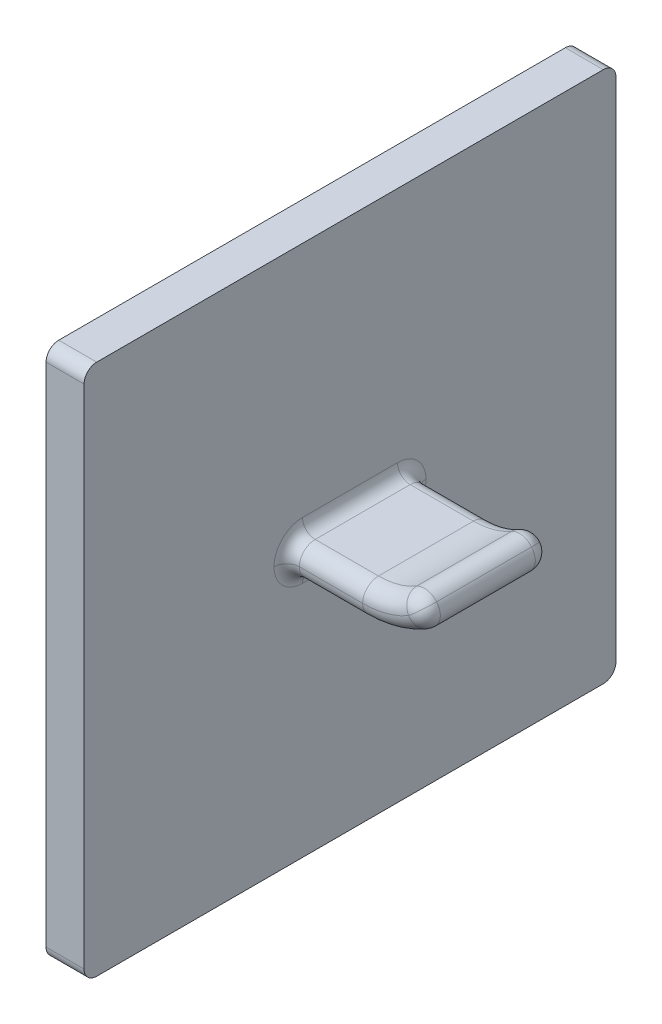
ISO-10303-21;
HEADER;
FILE_DESCRIPTION(('STEP AP214'),'2;1');
FILE_NAME('part.step','',(''),(''),'','','');
FILE_SCHEMA(('AUTOMOTIVE_DESIGN { 1 0 10303 214 1 1 1 1 }'));
ENDSEC;
DATA;
#1=APPLICATION_CONTEXT('core data for automotive mechanical design processes');
#2=APPLICATION_PROTOCOL_DEFINITION('international standard','automotive_design',2000,#1);
#3=PRODUCT_CONTEXT('',#1,'mechanical');
#4=PRODUCT('Part','Part','',(#3));
#5=PRODUCT_RELATED_PRODUCT_CATEGORY('part','',(#4));
#6=PRODUCT_DEFINITION_FORMATION('','',#4);
#7=PRODUCT_DEFINITION_CONTEXT('part definition',#1,'design');
#8=PRODUCT_DEFINITION('design','',#6,#7);
#9=PRODUCT_DEFINITION_SHAPE('','',#8);
#10=(LENGTH_UNIT() NAMED_UNIT(*) SI_UNIT(.MILLI.,.METRE.));
#11=(NAMED_UNIT(*) PLANE_ANGLE_UNIT() SI_UNIT($,.RADIAN.));
#12=(NAMED_UNIT(*) SI_UNIT($,.STERADIAN.) SOLID_ANGLE_UNIT());
#13=UNCERTAINTY_MEASURE_WITH_UNIT(LENGTH_MEASURE(1.E-05),#10,'distance_accuracy_value','');
#14=(GEOMETRIC_REPRESENTATION_CONTEXT(3) GLOBAL_UNCERTAINTY_ASSIGNED_CONTEXT((#13)) GLOBAL_UNIT_ASSIGNED_CONTEXT((#10,
#11,#12)) REPRESENTATION_CONTEXT('',''));
#15=CARTESIAN_POINT('',(0.,0.,0.));
#16=DIRECTION('',(0.,0.,1.));
#17=DIRECTION('',(1.,0.,0.));
#18=AXIS2_PLACEMENT_3D('',#15,#16,#17);
#19=CARTESIAN_POINT('',(0.,-2.5,10.));
#20=DIRECTION('',(0.,1.,0.));
#21=DIRECTION('',(0.,0.,1.));
#22=AXIS2_PLACEMENT_3D('',#19,#20,#21);
#23=PLANE('',#22);
#24=DIRECTION('',(1.,0.,0.));
#25=VECTOR('',#24,1.);
#26=CARTESIAN_POINT('',(0.,-2.5,8.75));
#27=LINE('',#26,#25);
#28=CARTESIAN_POINT('',(6.,-2.5,8.75));
#29=VERTEX_POINT('',#28);
#30=CARTESIAN_POINT('',(1.,-2.5,8.75));
#31=VERTEX_POINT('',#30);
#32=EDGE_CURVE('E308',#29,#31,#27,.F.);
#33=ORIENTED_EDGE('',*,*,#32,.T.);
#34=DIRECTION('',(0.,0.,-1.));
#35=VECTOR('',#34,1.);
#36=CARTESIAN_POINT('',(1.,-2.5,1.25));
#37=LINE('',#36,#35);
#38=CARTESIAN_POINT('',(1.,-2.5,1.25));
#39=VERTEX_POINT('',#38);
#40=EDGE_CURVE('E410',#31,#39,#37,.T.);
#41=ORIENTED_EDGE('',*,*,#40,.T.);
#42=DIRECTION('',(1.,0.,0.));
#43=VECTOR('',#42,1.);
#44=CARTESIAN_POINT('',(0.,-2.5,1.25));
#45=LINE('',#44,#43);
#46=CARTESIAN_POINT('',(6.,-2.5,1.25));
#47=VERTEX_POINT('',#46);
#48=EDGE_CURVE('E305',#39,#47,#45,.T.);
#49=ORIENTED_EDGE('',*,*,#48,.T.);
#50=DIRECTION('',(0.,0.,-1.));
#51=VECTOR('',#50,1.);
#52=CARTESIAN_POINT('',(6.,-2.5,10.));
#53=LINE('',#52,#51);
#54=EDGE_CURVE('E235',#29,#47,#53,.T.);
#55=ORIENTED_EDGE('',*,*,#54,.F.);
#56=EDGE_LOOP('',(#33,#41,#49,#55));
#57=FACE_BOUND('',#56,.T.);
#58=ADVANCED_FACE('F43',(#57),#23,.F.);
#59=CARTESIAN_POINT('',(6.,6.,10.));
#60=DIRECTION('',(0.,0.,-1.));
#61=DIRECTION('',(-1.,0.,0.));
#62=AXIS2_PLACEMENT_3D('',#59,#60,#61);
#63=CYLINDRICAL_SURFACE('',#62,8.5);
#64=ORIENTED_EDGE('',*,*,#54,.T.);
#65=CARTESIAN_POINT('',(6.,6.,1.25));
#66=DIRECTION('',(0.,0.,1.));
#67=DIRECTION('',(1.,0.,0.));
#68=AXIS2_PLACEMENT_3D('',#65,#66,#67);
#69=CIRCLE('',#68,8.5);
#70=CARTESIAN_POINT('',(10.259222389127,-1.3558836749883,1.25));
#71=VERTEX_POINT('',#70);
#72=EDGE_CURVE('E296',#47,#71,#69,.T.);
#73=ORIENTED_EDGE('',*,*,#72,.T.);
#74=DIRECTION('',(0.,0.,-1.));
#75=VECTOR('',#74,1.);
#76=CARTESIAN_POINT('',(10.259222389127,-1.3558836749883,10.));
#77=LINE('',#76,#75);
#78=CARTESIAN_POINT('',(10.259222389127,-1.3558836749883,8.75));
#79=VERTEX_POINT('',#78);
#80=EDGE_CURVE('E293',#71,#79,#77,.F.);
#81=ORIENTED_EDGE('',*,*,#80,.T.);
#82=CARTESIAN_POINT('',(6.,6.,8.75));
#83=DIRECTION('',(0.,0.,1.));
#84=DIRECTION('',(1.,0.,0.));
#85=AXIS2_PLACEMENT_3D('',#82,#83,#84);
#86=CIRCLE('',#85,8.5);
#87=EDGE_CURVE('E290',#79,#29,#86,.F.);
#88=ORIENTED_EDGE('',*,*,#87,.T.);
#89=EDGE_LOOP('',(#64,#73,#81,#88));
#90=FACE_BOUND('',#89,.T.);
#91=ADVANCED_FACE('F479',(#90),#63,.T.);
#92=CARTESIAN_POINT('',(6.,6.,10.));
#93=DIRECTION('',(0.,0.,-1.));
#94=DIRECTION('',(-1.,0.,0.));
#95=AXIS2_PLACEMENT_3D('',#92,#93,#94);
#96=CYLINDRICAL_SURFACE('',#95,6.);
#97=DIRECTION('',(0.,0.,-1.));
#98=VECTOR('',#97,1.);
#99=CARTESIAN_POINT('',(9.0065099217367,0.80761152353767,10.));
#100=LINE('',#99,#98);
#101=CARTESIAN_POINT('',(9.0065099217367,0.807611523537672,8.75));
#102=VERTEX_POINT('',#101);
#103=CARTESIAN_POINT('',(9.0065099217367,0.807611523537672,1.25));
#104=VERTEX_POINT('',#103);
#105=EDGE_CURVE('E283',#102,#104,#100,.T.);
#106=ORIENTED_EDGE('',*,*,#105,.T.);
#107=CARTESIAN_POINT('',(6.,6.,1.25));
#108=DIRECTION('',(0.,0.,1.));
#109=DIRECTION('',(1.,0.,0.));
#110=AXIS2_PLACEMENT_3D('',#107,#108,#109);
#111=CIRCLE('',#110,6.);
#112=CARTESIAN_POINT('',(6.,0.,1.25));
#113=VERTEX_POINT('',#112);
#114=EDGE_CURVE('E286',#104,#113,#111,.F.);
#115=ORIENTED_EDGE('',*,*,#114,.T.);
#116=DIRECTION('',(0.,0.,-1.));
#117=VECTOR('',#116,1.);
#118=CARTESIAN_POINT('',(6.,0.,10.));
#119=LINE('',#118,#117);
#120=CARTESIAN_POINT('',(6.,0.,8.75));
#121=VERTEX_POINT('',#120);
#122=EDGE_CURVE('E231',#121,#113,#119,.T.);
#123=ORIENTED_EDGE('',*,*,#122,.F.);
#124=CARTESIAN_POINT('',(6.,6.,8.75));
#125=DIRECTION('',(0.,0.,1.));
#126=DIRECTION('',(1.,0.,0.));
#127=AXIS2_PLACEMENT_3D('',#124,#125,#126);
#128=CIRCLE('',#127,6.);
#129=EDGE_CURVE('E280',#121,#102,#128,.T.);
#130=ORIENTED_EDGE('',*,*,#129,.T.);
#131=EDGE_LOOP('',(#106,#115,#123,#130));
#132=FACE_BOUND('',#131,.T.);
#133=ADVANCED_FACE('F526',(#132),#96,.F.);
#134=CARTESIAN_POINT('',(0.,0.,10.));
#135=DIRECTION('',(0.,-1.,0.));
#136=DIRECTION('',(0.,0.,-1.));
#137=AXIS2_PLACEMENT_3D('',#134,#135,#136);
#138=PLANE('',#137);
#139=DIRECTION('',(-1.,0.,0.));
#140=VECTOR('',#139,1.);
#141=CARTESIAN_POINT('',(0.,0.,1.25));
#142=LINE('',#141,#140);
#143=CARTESIAN_POINT('',(1.,0.,1.25));
#144=VERTEX_POINT('',#143);
#145=EDGE_CURVE('E299',#113,#144,#142,.T.);
#146=ORIENTED_EDGE('',*,*,#145,.T.);
#147=DIRECTION('',(0.,0.,-1.));
#148=VECTOR('',#147,1.);
#149=CARTESIAN_POINT('',(1.,0.,8.75));
#150=LINE('',#149,#148);
#151=CARTESIAN_POINT('',(1.,0.,8.75));
#152=VERTEX_POINT('',#151);
#153=EDGE_CURVE('E11',#144,#152,#150,.F.);
#154=ORIENTED_EDGE('',*,*,#153,.T.);
#155=DIRECTION('',(-1.,0.,0.));
#156=VECTOR('',#155,1.);
#157=CARTESIAN_POINT('',(6.,0.,8.75));
#158=LINE('',#157,#156);
#159=EDGE_CURVE('E302',#152,#121,#158,.F.);
#160=ORIENTED_EDGE('',*,*,#159,.T.);
#161=ORIENTED_EDGE('',*,*,#122,.T.);
#162=EDGE_LOOP('',(#146,#154,#160,#161));
#163=FACE_BOUND('',#162,.T.);
#164=ADVANCED_FACE('F455',(#163),#138,.F.);
#165=CARTESIAN_POINT('',(0.,0.,0.));
#166=DIRECTION('',(-1.,0.,0.));
#167=DIRECTION('',(0.,0.,1.));
#168=AXIS2_PLACEMENT_3D('',#165,#166,#167);
#169=PLANE('',#168);
#170=CARTESIAN_POINT('',(0.,-1.25,8.75));
#171=DIRECTION('',(-1.,0.,0.));
#172=DIRECTION('',(0.,0.,1.));
#173=AXIS2_PLACEMENT_3D('',#170,#171,#172);
#174=CIRCLE('',#173,2.25);
#175=CARTESIAN_POINT('',(0.,-3.5,8.75));
#176=VERTEX_POINT('',#175);
#177=CARTESIAN_POINT('',(0.,-1.25,11.));
#178=VERTEX_POINT('',#177);
#179=EDGE_CURVE('E396',#176,#178,#174,.T.);
#180=ORIENTED_EDGE('',*,*,#179,.T.);
#181=CARTESIAN_POINT('',(0.,-1.25,8.75));
#182=DIRECTION('',(-1.,0.,0.));
#183=DIRECTION('',(0.,0.,1.));
#184=AXIS2_PLACEMENT_3D('',#181,#182,#183);
#185=CIRCLE('',#184,2.25);
#186=CARTESIAN_POINT('',(0.,1.,8.75));
#187=VERTEX_POINT('',#186);
#188=EDGE_CURVE('E399',#178,#187,#185,.T.);
#189=ORIENTED_EDGE('',*,*,#188,.T.);
#190=DIRECTION('',(0.,0.,-1.));
#191=VECTOR('',#190,1.);
#192=CARTESIAN_POINT('',(0.,1.,1.25));
#193=LINE('',#192,#191);
#194=CARTESIAN_POINT('',(0.,1.,1.25));
#195=VERTEX_POINT('',#194);
#196=EDGE_CURVE('E312',#187,#195,#193,.T.);
#197=ORIENTED_EDGE('',*,*,#196,.T.);
#198=CARTESIAN_POINT('',(0.,-1.25,1.25));
#199=DIRECTION('',(-1.,0.,0.));
#200=DIRECTION('',(0.,0.,1.));
#201=AXIS2_PLACEMENT_3D('',#198,#199,#200);
#202=CIRCLE('',#201,2.25);
#203=CARTESIAN_POINT('',(0.,-1.25,-1.));
#204=VERTEX_POINT('',#203);
#205=EDGE_CURVE('E387',#195,#204,#202,.T.);
#206=ORIENTED_EDGE('',*,*,#205,.T.);
#207=CARTESIAN_POINT('',(0.,-1.25,1.25));
#208=DIRECTION('',(-1.,0.,0.));
#209=DIRECTION('',(0.,0.,1.));
#210=AXIS2_PLACEMENT_3D('',#207,#208,#209);
#211=CIRCLE('',#210,2.25);
#212=CARTESIAN_POINT('',(0.,-3.5,1.25));
#213=VERTEX_POINT('',#212);
#214=EDGE_CURVE('E390',#204,#213,#211,.T.);
#215=ORIENTED_EDGE('',*,*,#214,.T.);
#216=DIRECTION('',(0.,0.,-1.));
#217=VECTOR('',#216,1.);
#218=CARTESIAN_POINT('',(0.,-3.5,8.75));
#219=LINE('',#218,#217);
#220=EDGE_CURVE('E393',#213,#176,#219,.F.);
#221=ORIENTED_EDGE('',*,*,#220,.T.);
#222=EDGE_LOOP('',(#180,#189,#197,#206,#215,#221));
#223=FACE_BOUND('',#222,.T.);
#224=DIRECTION('',(0.,1.,0.));
#225=VECTOR('',#224,1.);
#226=CARTESIAN_POINT('',(0.,-22.25,26.));
#227=LINE('',#226,#225);
#228=CARTESIAN_POINT('',(0.,-21.25,26.));
#229=VERTEX_POINT('',#228);
#230=CARTESIAN_POINT('',(0.,18.75,26.));
#231=VERTEX_POINT('',#230);
#232=EDGE_CURVE('E208',#229,#231,#227,.T.);
#233=ORIENTED_EDGE('',*,*,#232,.F.);
#234=CARTESIAN_POINT('',(0.,-21.25,25.));
#235=DIRECTION('',(-1.,0.,0.));
#236=DIRECTION('',(0.,0.,1.));
#237=AXIS2_PLACEMENT_3D('',#234,#235,#236);
#238=CIRCLE('',#237,1.);
#239=CARTESIAN_POINT('',(0.,-22.25,25.));
#240=VERTEX_POINT('',#239);
#241=EDGE_CURVE('E190',#229,#240,#238,.F.);
#242=ORIENTED_EDGE('',*,*,#241,.T.);
#243=DIRECTION('',(0.,0.,1.));
#244=VECTOR('',#243,1.);
#245=CARTESIAN_POINT('',(0.,-22.25,26.));
#246=LINE('',#245,#244);
#247=CARTESIAN_POINT('',(0.,-22.25,-15.));
#248=VERTEX_POINT('',#247);
#249=EDGE_CURVE('E220',#248,#240,#246,.T.);
#250=ORIENTED_EDGE('',*,*,#249,.F.);
#251=CARTESIAN_POINT('',(0.,-21.25,-15.));
#252=DIRECTION('',(-1.,0.,0.));
#253=DIRECTION('',(0.,0.,1.));
#254=AXIS2_PLACEMENT_3D('',#251,#252,#253);
#255=CIRCLE('',#254,1.);
#256=CARTESIAN_POINT('',(0.,-21.25,-16.));
#257=VERTEX_POINT('',#256);
#258=EDGE_CURVE('E202',#248,#257,#255,.F.);
#259=ORIENTED_EDGE('',*,*,#258,.T.);
#260=DIRECTION('',(0.,-1.,0.));
#261=VECTOR('',#260,1.);
#262=CARTESIAN_POINT('',(0.,-22.25,-16.));
#263=LINE('',#262,#261);
#264=CARTESIAN_POINT('',(0.,18.75,-16.));
#265=VERTEX_POINT('',#264);
#266=EDGE_CURVE('E227',#265,#257,#263,.T.);
#267=ORIENTED_EDGE('',*,*,#266,.F.);
#268=CARTESIAN_POINT('',(0.,18.75,-15.));
#269=DIRECTION('',(-1.,0.,0.));
#270=DIRECTION('',(0.,0.,1.));
#271=AXIS2_PLACEMENT_3D('',#268,#269,#270);
#272=CIRCLE('',#271,1.);
#273=CARTESIAN_POINT('',(0.,19.75,-15.));
#274=VERTEX_POINT('',#273);
#275=EDGE_CURVE('E244',#265,#274,#272,.F.);
#276=ORIENTED_EDGE('',*,*,#275,.T.);
#277=DIRECTION('',(0.,0.,-1.));
#278=VECTOR('',#277,1.);
#279=CARTESIAN_POINT('',(0.,19.75,26.));
#280=LINE('',#279,#278);
#281=CARTESIAN_POINT('',(0.,19.75,25.));
#282=VERTEX_POINT('',#281);
#283=EDGE_CURVE('E219',#282,#274,#280,.T.);
#284=ORIENTED_EDGE('',*,*,#283,.F.);
#285=CARTESIAN_POINT('',(0.,18.75,25.));
#286=DIRECTION('',(-1.,0.,0.));
#287=DIRECTION('',(0.,0.,1.));
#288=AXIS2_PLACEMENT_3D('',#285,#286,#287);
#289=CIRCLE('',#288,1.);
#290=EDGE_CURVE('E213',#282,#231,#289,.F.);
#291=ORIENTED_EDGE('',*,*,#290,.T.);
#292=EDGE_LOOP('',(#233,#242,#250,#259,#267,#276,#284,#291));
#293=FACE_BOUND('',#292,.T.);
#294=ADVANCED_FACE('F216',(#223,#293),#169,.F.);
#295=CARTESIAN_POINT('',(-3.,-22.25,-16.));
#296=DIRECTION('',(0.,0.,1.));
#297=DIRECTION('',(1.,0.,0.));
#298=AXIS2_PLACEMENT_3D('',#295,#296,#297);
#299=PLANE('',#298);
#300=ORIENTED_EDGE('',*,*,#266,.T.);
#301=DIRECTION('',(1.,0.,0.));
#302=VECTOR('',#301,1.);
#303=CARTESIAN_POINT('',(-3.,-21.25,-16.));
#304=LINE('',#303,#302);
#305=CARTESIAN_POINT('',(-3.,-21.25,-16.));
#306=VERTEX_POINT('',#305);
#307=EDGE_CURVE('E270',#257,#306,#304,.F.);
#308=ORIENTED_EDGE('',*,*,#307,.T.);
#309=DIRECTION('',(0.,-1.,0.));
#310=VECTOR('',#309,1.);
#311=CARTESIAN_POINT('',(-3.,-22.25,-16.));
#312=LINE('',#311,#310);
#313=CARTESIAN_POINT('',(-3.,18.75,-16.));
#314=VERTEX_POINT('',#313);
#315=EDGE_CURVE('E225',#314,#306,#312,.T.);
#316=ORIENTED_EDGE('',*,*,#315,.F.);
#317=DIRECTION('',(1.,0.,0.));
#318=VECTOR('',#317,1.);
#319=CARTESIAN_POINT('',(-3.,18.75,-16.));
#320=LINE('',#319,#318);
#321=EDGE_CURVE('E266',#314,#265,#320,.T.);
#322=ORIENTED_EDGE('',*,*,#321,.T.);
#323=EDGE_LOOP('',(#300,#308,#316,#322));
#324=FACE_BOUND('',#323,.T.);
#325=ADVANCED_FACE('F753',(#324),#299,.F.);
#326=CARTESIAN_POINT('',(-3.,-22.25,26.));
#327=DIRECTION('',(0.,1.,0.));
#328=DIRECTION('',(0.,0.,1.));
#329=AXIS2_PLACEMENT_3D('',#326,#327,#328);
#330=PLANE('',#329);
#331=ORIENTED_EDGE('',*,*,#249,.T.);
#332=DIRECTION('',(1.,0.,0.));
#333=VECTOR('',#332,1.);
#334=CARTESIAN_POINT('',(-3.,-22.25,25.));
#335=LINE('',#334,#333);
#336=CARTESIAN_POINT('',(-3.,-22.25,25.));
#337=VERTEX_POINT('',#336);
#338=EDGE_CURVE('E195',#240,#337,#335,.F.);
#339=ORIENTED_EDGE('',*,*,#338,.T.);
#340=DIRECTION('',(0.,0.,1.));
#341=VECTOR('',#340,1.);
#342=CARTESIAN_POINT('',(-3.,-22.25,26.));
#343=LINE('',#342,#341);
#344=CARTESIAN_POINT('',(-3.,-22.25,-15.));
#345=VERTEX_POINT('',#344);
#346=EDGE_CURVE('E823',#345,#337,#343,.T.);
#347=ORIENTED_EDGE('',*,*,#346,.F.);
#348=DIRECTION('',(1.,0.,0.));
#349=VECTOR('',#348,1.);
#350=CARTESIAN_POINT('',(-3.,-22.25,-15.));
#351=LINE('',#350,#349);
#352=EDGE_CURVE('E201',#345,#248,#351,.T.);
#353=ORIENTED_EDGE('',*,*,#352,.T.);
#354=EDGE_LOOP('',(#331,#339,#347,#353));
#355=FACE_BOUND('',#354,.T.);
#356=ADVANCED_FACE('F745',(#355),#330,.F.);
#357=CARTESIAN_POINT('',(-3.,-22.25,26.));
#358=DIRECTION('',(0.,0.,-1.));
#359=DIRECTION('',(-1.,0.,0.));
#360=AXIS2_PLACEMENT_3D('',#357,#358,#359);
#361=PLANE('',#360);
#362=DIRECTION('',(0.,1.,0.));
#363=VECTOR('',#362,1.);
#364=CARTESIAN_POINT('',(-3.,-22.25,26.));
#365=LINE('',#364,#363);
#366=CARTESIAN_POINT('',(-3.,-21.25,26.));
#367=VERTEX_POINT('',#366);
#368=CARTESIAN_POINT('',(-3.,18.75,26.));
#369=VERTEX_POINT('',#368);
#370=EDGE_CURVE('E211',#367,#369,#365,.T.);
#371=ORIENTED_EDGE('',*,*,#370,.F.);
#372=DIRECTION('',(1.,0.,0.));
#373=VECTOR('',#372,1.);
#374=CARTESIAN_POINT('',(-3.,-21.25,26.));
#375=LINE('',#374,#373);
#376=EDGE_CURVE('E194',#367,#229,#375,.T.);
#377=ORIENTED_EDGE('',*,*,#376,.T.);
#378=ORIENTED_EDGE('',*,*,#232,.T.);
#379=DIRECTION('',(1.,0.,0.));
#380=VECTOR('',#379,1.);
#381=CARTESIAN_POINT('',(-3.,18.75,26.));
#382=LINE('',#381,#380);
#383=EDGE_CURVE('E214',#231,#369,#382,.F.);
#384=ORIENTED_EDGE('',*,*,#383,.T.);
#385=EDGE_LOOP('',(#371,#377,#378,#384));
#386=FACE_BOUND('',#385,.T.);
#387=ADVANCED_FACE('F207',(#386),#361,.F.);
#388=CARTESIAN_POINT('',(-3.,19.75,26.));
#389=DIRECTION('',(0.,-1.,0.));
#390=DIRECTION('',(0.,0.,-1.));
#391=AXIS2_PLACEMENT_3D('',#388,#389,#390);
#392=PLANE('',#391);
#393=ORIENTED_EDGE('',*,*,#283,.T.);
#394=DIRECTION('',(1.,0.,0.));
#395=VECTOR('',#394,1.);
#396=CARTESIAN_POINT('',(-3.,19.75,-15.));
#397=LINE('',#396,#395);
#398=CARTESIAN_POINT('',(-3.,19.75,-15.));
#399=VERTEX_POINT('',#398);
#400=EDGE_CURVE('E277',#274,#399,#397,.F.);
#401=ORIENTED_EDGE('',*,*,#400,.T.);
#402=DIRECTION('',(0.,0.,-1.));
#403=VECTOR('',#402,1.);
#404=CARTESIAN_POINT('',(-3.,19.75,26.));
#405=LINE('',#404,#403);
#406=CARTESIAN_POINT('',(-3.,19.75,25.));
#407=VERTEX_POINT('',#406);
#408=EDGE_CURVE('E236',#407,#399,#405,.T.);
#409=ORIENTED_EDGE('',*,*,#408,.F.);
#410=DIRECTION('',(1.,0.,0.));
#411=VECTOR('',#410,1.);
#412=CARTESIAN_POINT('',(-3.,19.75,25.));
#413=LINE('',#412,#411);
#414=EDGE_CURVE('E273',#407,#282,#413,.T.);
#415=ORIENTED_EDGE('',*,*,#414,.T.);
#416=EDGE_LOOP('',(#393,#401,#409,#415));
#417=FACE_BOUND('',#416,.T.);
#418=ADVANCED_FACE('F728',(#417),#392,.F.);
#419=CARTESIAN_POINT('',(-3.,0.,0.));
#420=DIRECTION('',(-1.,0.,0.));
#421=DIRECTION('',(0.,0.,1.));
#422=AXIS2_PLACEMENT_3D('',#419,#420,#421);
#423=PLANE('',#422);
#424=ORIENTED_EDGE('',*,*,#346,.T.);
#425=CARTESIAN_POINT('',(-3.,-21.25,25.));
#426=DIRECTION('',(-1.,0.,0.));
#427=DIRECTION('',(0.,0.,1.));
#428=AXIS2_PLACEMENT_3D('',#425,#426,#427);
#429=CIRCLE('',#428,1.);
#430=EDGE_CURVE('E263',#337,#367,#429,.T.);
#431=ORIENTED_EDGE('',*,*,#430,.T.);
#432=ORIENTED_EDGE('',*,*,#370,.T.);
#433=CARTESIAN_POINT('',(-3.,18.75,25.));
#434=DIRECTION('',(-1.,0.,0.));
#435=DIRECTION('',(0.,0.,1.));
#436=AXIS2_PLACEMENT_3D('',#433,#434,#435);
#437=CIRCLE('',#436,1.);
#438=EDGE_CURVE('E254',#369,#407,#437,.T.);
#439=ORIENTED_EDGE('',*,*,#438,.T.);
#440=ORIENTED_EDGE('',*,*,#408,.T.);
#441=CARTESIAN_POINT('',(-3.,18.75,-15.));
#442=DIRECTION('',(-1.,0.,0.));
#443=DIRECTION('',(0.,0.,1.));
#444=AXIS2_PLACEMENT_3D('',#441,#442,#443);
#445=CIRCLE('',#444,1.);
#446=EDGE_CURVE('E257',#399,#314,#445,.T.);
#447=ORIENTED_EDGE('',*,*,#446,.T.);
#448=ORIENTED_EDGE('',*,*,#315,.T.);
#449=CARTESIAN_POINT('',(-3.,-21.25,-15.));
#450=DIRECTION('',(-1.,0.,0.));
#451=DIRECTION('',(0.,0.,1.));
#452=AXIS2_PLACEMENT_3D('',#449,#450,#451);
#453=CIRCLE('',#452,1.);
#454=EDGE_CURVE('E260',#306,#345,#453,.T.);
#455=ORIENTED_EDGE('',*,*,#454,.T.);
#456=EDGE_LOOP('',(#424,#431,#432,#439,#440,#447,#448,#455));
#457=FACE_BOUND('',#456,.T.);
#458=ADVANCED_FACE('F533',(#457),#423,.T.);
#459=CARTESIAN_POINT('',(-3.,-21.25,25.));
#460=DIRECTION('',(1.,0.,0.));
#461=DIRECTION('',(0.,0.,-1.));
#462=AXIS2_PLACEMENT_3D('',#459,#460,#461);
#463=CYLINDRICAL_SURFACE('',#462,1.);
#464=ORIENTED_EDGE('',*,*,#430,.F.);
#465=ORIENTED_EDGE('',*,*,#338,.F.);
#466=ORIENTED_EDGE('',*,*,#241,.F.);
#467=ORIENTED_EDGE('',*,*,#376,.F.);
#468=EDGE_LOOP('',(#464,#465,#466,#467));
#469=FACE_BOUND('',#468,.T.);
#470=ADVANCED_FACE('F193',(#469),#463,.T.);
#471=CARTESIAN_POINT('',(-3.,-21.25,-15.));
#472=DIRECTION('',(1.,0.,0.));
#473=DIRECTION('',(0.,0.,-1.));
#474=AXIS2_PLACEMENT_3D('',#471,#472,#473);
#475=CYLINDRICAL_SURFACE('',#474,1.);
#476=ORIENTED_EDGE('',*,*,#454,.F.);
#477=ORIENTED_EDGE('',*,*,#307,.F.);
#478=ORIENTED_EDGE('',*,*,#258,.F.);
#479=ORIENTED_EDGE('',*,*,#352,.F.);
#480=EDGE_LOOP('',(#476,#477,#478,#479));
#481=FACE_BOUND('',#480,.T.);
#482=ADVANCED_FACE('F532',(#481),#475,.T.);
#483=CARTESIAN_POINT('',(-3.,18.75,-15.));
#484=DIRECTION('',(1.,0.,0.));
#485=DIRECTION('',(0.,0.,-1.));
#486=AXIS2_PLACEMENT_3D('',#483,#484,#485);
#487=CYLINDRICAL_SURFACE('',#486,1.);
#488=ORIENTED_EDGE('',*,*,#446,.F.);
#489=ORIENTED_EDGE('',*,*,#400,.F.);
#490=ORIENTED_EDGE('',*,*,#275,.F.);
#491=ORIENTED_EDGE('',*,*,#321,.F.);
#492=EDGE_LOOP('',(#488,#489,#490,#491));
#493=FACE_BOUND('',#492,.T.);
#494=ADVANCED_FACE('F536',(#493),#487,.T.);
#495=CARTESIAN_POINT('',(-3.,18.75,25.));
#496=DIRECTION('',(1.,0.,0.));
#497=DIRECTION('',(0.,0.,-1.));
#498=AXIS2_PLACEMENT_3D('',#495,#496,#497);
#499=CYLINDRICAL_SURFACE('',#498,1.);
#500=ORIENTED_EDGE('',*,*,#438,.F.);
#501=ORIENTED_EDGE('',*,*,#383,.F.);
#502=ORIENTED_EDGE('',*,*,#290,.F.);
#503=ORIENTED_EDGE('',*,*,#414,.F.);
#504=EDGE_LOOP('',(#500,#501,#502,#503));
#505=FACE_BOUND('',#504,.T.);
#506=ADVANCED_FACE('F540',(#505),#499,.T.);
#507=CARTESIAN_POINT('',(6.,-1.25,8.75));
#508=DIRECTION('',(-1.,0.,0.));
#509=DIRECTION('',(0.,0.,1.));
#510=AXIS2_PLACEMENT_3D('',#507,#508,#509);
#511=CYLINDRICAL_SURFACE('',#510,1.25);
#512=DIRECTION('',(1.,0.,0.));
#513=VECTOR('',#512,1.);
#514=CARTESIAN_POINT('',(6.,-1.25,10.));
#515=LINE('',#514,#513);
#516=CARTESIAN_POINT('',(1.,-1.25,10.));
#517=VERTEX_POINT('',#516);
#518=CARTESIAN_POINT('',(6.,-1.25,10.));
#519=VERTEX_POINT('',#518);
#520=EDGE_CURVE('E378',#517,#519,#515,.T.);
#521=ORIENTED_EDGE('',*,*,#520,.F.);
#522=CARTESIAN_POINT('',(1.,-1.25,8.75));
#523=DIRECTION('',(-1.,0.,0.));
#524=DIRECTION('',(0.,0.,1.));
#525=AXIS2_PLACEMENT_3D('',#522,#523,#524);
#526=CIRCLE('',#525,1.25);
#527=EDGE_CURVE('E407',#517,#31,#526,.F.);
#528=ORIENTED_EDGE('',*,*,#527,.T.);
#529=ORIENTED_EDGE('',*,*,#32,.F.);
#530=CARTESIAN_POINT('',(6.,-1.25,8.75));
#531=DIRECTION('',(1.,0.,0.));
#532=DIRECTION('',(0.,0.,-1.));
#533=AXIS2_PLACEMENT_3D('',#530,#531,#532);
#534=CIRCLE('',#533,1.25);
#535=EDGE_CURVE('E381',#519,#29,#534,.T.);
#536=ORIENTED_EDGE('',*,*,#535,.F.);
#537=EDGE_LOOP('',(#521,#528,#529,#536));
#538=FACE_BOUND('',#537,.T.);
#539=ADVANCED_FACE('F473',(#538),#511,.T.);
#540=CARTESIAN_POINT('',(6.,6.,8.75));
#541=DIRECTION('',(0.,0.,1.));
#542=DIRECTION('',(1.,0.,0.));
#543=AXIS2_PLACEMENT_3D('',#540,#541,#542);
#544=TOROIDAL_SURFACE('',#543,7.25,1.25);
#545=ORIENTED_EDGE('',*,*,#535,.T.);
#546=ORIENTED_EDGE('',*,*,#87,.F.);
#547=CARTESIAN_POINT('',(9.63286615543185,-0.274136075725314,8.75));
#548=DIRECTION('',(0.865398079410388,0.501084986956117,0.));
#549=DIRECTION('',(-0.501084986956117,0.865398079410388,0.));
#550=AXIS2_PLACEMENT_3D('',#547,#548,#549);
#551=CIRCLE('',#550,1.25);
#552=CARTESIAN_POINT('',(9.63286615543185,-0.274136075725314,10.));
#553=VERTEX_POINT('',#552);
#554=EDGE_CURVE('E374',#553,#79,#551,.T.);
#555=ORIENTED_EDGE('',*,*,#554,.F.);
#556=CARTESIAN_POINT('',(6.,6.,10.));
#557=DIRECTION('',(0.,0.,1.));
#558=DIRECTION('',(1.,0.,0.));
#559=AXIS2_PLACEMENT_3D('',#556,#557,#558);
#560=CIRCLE('',#559,7.25);
#561=EDGE_CURVE('E366',#519,#553,#560,.T.);
#562=ORIENTED_EDGE('',*,*,#561,.F.);
#563=EDGE_LOOP('',(#545,#546,#555,#562));
#564=FACE_BOUND('',#563,.T.);
#565=ADVANCED_FACE('F503',(#564),#544,.T.);
#566=CARTESIAN_POINT('',(6.,-1.25,8.75));
#567=DIRECTION('',(1.,0.,0.));
#568=DIRECTION('',(0.,0.,-1.));
#569=AXIS2_PLACEMENT_3D('',#566,#567,#568);
#570=CYLINDRICAL_SURFACE('',#569,1.25);
#571=ORIENTED_EDGE('',*,*,#159,.F.);
#572=CARTESIAN_POINT('',(1.,-1.25,8.75));
#573=DIRECTION('',(-1.,0.,0.));
#574=DIRECTION('',(0.,0.,1.));
#575=AXIS2_PLACEMENT_3D('',#572,#573,#574);
#576=CIRCLE('',#575,1.25);
#577=EDGE_CURVE('E403',#152,#517,#576,.F.);
#578=ORIENTED_EDGE('',*,*,#577,.T.);
#579=ORIENTED_EDGE('',*,*,#520,.T.);
#580=CARTESIAN_POINT('',(6.,-1.25,8.75));
#581=DIRECTION('',(1.,0.,0.));
#582=DIRECTION('',(0.,0.,-1.));
#583=AXIS2_PLACEMENT_3D('',#580,#581,#582);
#584=CIRCLE('',#583,1.25);
#585=EDGE_CURVE('E362',#121,#519,#584,.T.);
#586=ORIENTED_EDGE('',*,*,#585,.F.);
#587=EDGE_LOOP('',(#571,#578,#579,#586));
#588=FACE_BOUND('',#587,.T.);
#589=ADVANCED_FACE('F460',(#588),#570,.T.);
#590=CARTESIAN_POINT('',(9.63286615543185,-0.274136075725314,8.75));
#591=DIRECTION('',(0.,0.,1.));
#592=DIRECTION('',(1.,0.,0.));
#593=AXIS2_PLACEMENT_3D('',#590,#591,#592);
#594=SPHERICAL_SURFACE('',#593,1.25);
#595=CARTESIAN_POINT('',(9.63286615543185,-0.274136075725314,8.75));
#596=DIRECTION('',(0.64278760968654,-0.766044443118978,0.));
#597=DIRECTION('',(0.766044443118978,0.64278760968654,0.));
#598=AXIS2_PLACEMENT_3D('',#595,#596,#597);
#599=CIRCLE('',#598,1.25);
#600=CARTESIAN_POINT('',(10.5904217093306,0.529348436382861,8.75));
#601=VERTEX_POINT('',#600);
#602=EDGE_CURVE('E370',#553,#601,#599,.F.);
#603=ORIENTED_EDGE('',*,*,#602,.F.);
#604=ORIENTED_EDGE('',*,*,#554,.T.);
#605=CARTESIAN_POINT('',(9.63286615543185,-0.274136075725314,8.75));
#606=DIRECTION('',(0.,0.,1.));
#607=DIRECTION('',(1.,0.,0.));
#608=AXIS2_PLACEMENT_3D('',#605,#606,#607);
#609=CIRCLE('',#608,1.25);
#610=EDGE_CURVE('E358',#601,#79,#609,.F.);
#611=ORIENTED_EDGE('',*,*,#610,.F.);
#612=EDGE_LOOP('',(#603,#604,#611));
#613=FACE_BOUND('',#612,.T.);
#614=ADVANCED_FACE('F507',(#613),#594,.T.);
#615=CARTESIAN_POINT('',(6.,6.,8.75));
#616=DIRECTION('',(0.,0.,1.));
#617=DIRECTION('',(1.,0.,0.));
#618=AXIS2_PLACEMENT_3D('',#615,#616,#617);
#619=TOROIDAL_SURFACE('',#618,7.25,1.25);
#620=ORIENTED_EDGE('',*,*,#585,.T.);
#621=ORIENTED_EDGE('',*,*,#561,.T.);
#622=CARTESIAN_POINT('',(9.63286615543185,-0.274136075725314,8.75));
#623=DIRECTION('',(0.865398079410388,0.501084986956117,0.));
#624=DIRECTION('',(-0.501084986956117,0.865398079410388,0.));
#625=AXIS2_PLACEMENT_3D('',#622,#623,#624);
#626=CIRCLE('',#625,1.25);
#627=EDGE_CURVE('E354',#102,#553,#626,.T.);
#628=ORIENTED_EDGE('',*,*,#627,.F.);
#629=ORIENTED_EDGE('',*,*,#129,.F.);
#630=EDGE_LOOP('',(#620,#621,#628,#629));
#631=FACE_BOUND('',#630,.T.);
#632=ADVANCED_FACE('F511',(#631),#619,.T.);
#633=CARTESIAN_POINT('',(9.63286615543185,-0.274136075725314,10.));
#634=DIRECTION('',(0.,0.,-1.));
#635=DIRECTION('',(-1.,0.,0.));
#636=AXIS2_PLACEMENT_3D('',#633,#634,#635);
#637=CYLINDRICAL_SURFACE('',#636,1.25);
#638=ORIENTED_EDGE('',*,*,#610,.T.);
#639=ORIENTED_EDGE('',*,*,#80,.F.);
#640=CARTESIAN_POINT('',(9.63286615543185,-0.274136075725314,1.25));
#641=DIRECTION('',(0.,0.,-1.));
#642=DIRECTION('',(-1.,0.,0.));
#643=AXIS2_PLACEMENT_3D('',#640,#641,#642);
#644=CIRCLE('',#643,1.25);
#645=CARTESIAN_POINT('',(10.5904217093306,0.529348436382861,1.25));
#646=VERTEX_POINT('',#645);
#647=EDGE_CURVE('E350',#646,#71,#644,.T.);
#648=ORIENTED_EDGE('',*,*,#647,.F.);
#649=DIRECTION('',(0.,0.,-1.));
#650=VECTOR('',#649,1.);
#651=CARTESIAN_POINT('',(10.5904217093306,0.529348436382861,10.));
#652=LINE('',#651,#650);
#653=EDGE_CURVE('E342',#601,#646,#652,.T.);
#654=ORIENTED_EDGE('',*,*,#653,.F.);
#655=EDGE_LOOP('',(#638,#639,#648,#654));
#656=FACE_BOUND('',#655,.T.);
#657=ADVANCED_FACE('F501',(#656),#637,.T.);
#658=CARTESIAN_POINT('',(9.63286615543185,-0.274136075725314,8.75));
#659=DIRECTION('',(0.,0.,1.));
#660=DIRECTION('',(1.,0.,0.));
#661=AXIS2_PLACEMENT_3D('',#658,#659,#660);
#662=SPHERICAL_SURFACE('',#661,1.25);
#663=ORIENTED_EDGE('',*,*,#627,.T.);
#664=ORIENTED_EDGE('',*,*,#602,.T.);
#665=CARTESIAN_POINT('',(9.63286615543185,-0.274136075725314,8.75));
#666=DIRECTION('',(0.,0.,1.));
#667=DIRECTION('',(1.,0.,0.));
#668=AXIS2_PLACEMENT_3D('',#665,#666,#667);
#669=CIRCLE('',#668,1.25);
#670=EDGE_CURVE('E338',#102,#601,#669,.F.);
#671=ORIENTED_EDGE('',*,*,#670,.F.);
#672=EDGE_LOOP('',(#663,#664,#671));
#673=FACE_BOUND('',#672,.T.);
#674=ADVANCED_FACE('F512',(#673),#662,.T.);
#675=CARTESIAN_POINT('',(9.63286615543185,-0.274136075725314,1.25));
#676=DIRECTION('',(0.,0.,-1.));
#677=DIRECTION('',(-1.,0.,0.));
#678=AXIS2_PLACEMENT_3D('',#675,#676,#677);
#679=SPHERICAL_SURFACE('',#678,1.25);
#680=CARTESIAN_POINT('',(9.63286615543185,-0.274136075725314,1.25));
#681=DIRECTION('',(0.642787609686539,-0.766044443118979,0.));
#682=DIRECTION('',(0.766044443118979,0.642787609686539,0.));
#683=AXIS2_PLACEMENT_3D('',#680,#681,#682);
#684=CIRCLE('',#683,1.25);
#685=CARTESIAN_POINT('',(9.63286615543185,-0.274136075725314,0.));
#686=VERTEX_POINT('',#685);
#687=EDGE_CURVE('E346',#646,#686,#684,.F.);
#688=ORIENTED_EDGE('',*,*,#687,.F.);
#689=ORIENTED_EDGE('',*,*,#647,.T.);
#690=CARTESIAN_POINT('',(9.63286615543185,-0.274136075725314,1.25));
#691=DIRECTION('',(0.865398079410388,0.501084986956117,0.));
#692=DIRECTION('',(-0.501084986956117,0.865398079410388,0.));
#693=AXIS2_PLACEMENT_3D('',#690,#691,#692);
#694=CIRCLE('',#693,1.25);
#695=EDGE_CURVE('E331',#686,#71,#694,.F.);
#696=ORIENTED_EDGE('',*,*,#695,.F.);
#697=EDGE_LOOP('',(#688,#689,#696));
#698=FACE_BOUND('',#697,.T.);
#699=ADVANCED_FACE('F489',(#698),#679,.T.);
#700=CARTESIAN_POINT('',(9.63286615543185,-0.274136075725314,10.));
#701=DIRECTION('',(0.,0.,-1.));
#702=DIRECTION('',(-1.,0.,0.));
#703=AXIS2_PLACEMENT_3D('',#700,#701,#702);
#704=CYLINDRICAL_SURFACE('',#703,1.25);
#705=ORIENTED_EDGE('',*,*,#670,.T.);
#706=ORIENTED_EDGE('',*,*,#653,.T.);
#707=CARTESIAN_POINT('',(9.63286615543185,-0.274136075725314,1.25));
#708=DIRECTION('',(0.,0.,-1.));
#709=DIRECTION('',(-1.,0.,0.));
#710=AXIS2_PLACEMENT_3D('',#707,#708,#709);
#711=CIRCLE('',#710,1.25);
#712=EDGE_CURVE('E327',#104,#646,#711,.T.);
#713=ORIENTED_EDGE('',*,*,#712,.F.);
#714=ORIENTED_EDGE('',*,*,#105,.F.);
#715=EDGE_LOOP('',(#705,#706,#713,#714));
#716=FACE_BOUND('',#715,.T.);
#717=ADVANCED_FACE('F497',(#716),#704,.T.);
#718=CARTESIAN_POINT('',(0.,-1.25,1.25));
#719=DIRECTION('',(1.,0.,0.));
#720=DIRECTION('',(0.,0.,-1.));
#721=AXIS2_PLACEMENT_3D('',#718,#719,#720);
#722=CYLINDRICAL_SURFACE('',#721,1.25);
#723=ORIENTED_EDGE('',*,*,#48,.F.);
#724=CARTESIAN_POINT('',(1.,-1.25,1.25));
#725=DIRECTION('',(-1.,0.,0.));
#726=DIRECTION('',(0.,0.,1.));
#727=AXIS2_PLACEMENT_3D('',#724,#725,#726);
#728=CIRCLE('',#727,1.25);
#729=CARTESIAN_POINT('',(1.,-1.25,0.));
#730=VERTEX_POINT('',#729);
#731=EDGE_CURVE('E68',#39,#730,#728,.F.);
#732=ORIENTED_EDGE('',*,*,#731,.T.);
#733=DIRECTION('',(1.,0.,0.));
#734=VECTOR('',#733,1.);
#735=CARTESIAN_POINT('',(6.,-1.25,0.));
#736=LINE('',#735,#734);
#737=CARTESIAN_POINT('',(6.,-1.25,0.));
#738=VERTEX_POINT('',#737);
#739=EDGE_CURVE('E324',#738,#730,#736,.F.);
#740=ORIENTED_EDGE('',*,*,#739,.F.);
#741=CARTESIAN_POINT('',(6.,-1.25,1.25));
#742=DIRECTION('',(1.,0.,0.));
#743=DIRECTION('',(0.,0.,-1.));
#744=AXIS2_PLACEMENT_3D('',#741,#742,#743);
#745=CIRCLE('',#744,1.25);
#746=EDGE_CURVE('E335',#47,#738,#745,.T.);
#747=ORIENTED_EDGE('',*,*,#746,.F.);
#748=EDGE_LOOP('',(#723,#732,#740,#747));
#749=FACE_BOUND('',#748,.T.);
#750=ADVANCED_FACE('F483',(#749),#722,.T.);
#751=CARTESIAN_POINT('',(6.,6.,1.25));
#752=DIRECTION('',(0.,0.,1.));
#753=DIRECTION('',(1.,0.,0.));
#754=AXIS2_PLACEMENT_3D('',#751,#752,#753);
#755=TOROIDAL_SURFACE('',#754,7.25,1.25);
#756=ORIENTED_EDGE('',*,*,#72,.F.);
#757=ORIENTED_EDGE('',*,*,#746,.T.);
#758=CARTESIAN_POINT('',(6.,6.,0.));
#759=DIRECTION('',(0.,0.,1.));
#760=DIRECTION('',(1.,0.,0.));
#761=AXIS2_PLACEMENT_3D('',#758,#759,#760);
#762=CIRCLE('',#761,7.25);
#763=EDGE_CURVE('E320',#686,#738,#762,.F.);
#764=ORIENTED_EDGE('',*,*,#763,.F.);
#765=ORIENTED_EDGE('',*,*,#695,.T.);
#766=EDGE_LOOP('',(#756,#757,#764,#765));
#767=FACE_BOUND('',#766,.T.);
#768=ADVANCED_FACE('F486',(#767),#755,.T.);
#769=CARTESIAN_POINT('',(9.63286615543185,-0.274136075725314,1.25));
#770=DIRECTION('',(0.,0.,-1.));
#771=DIRECTION('',(0.,1.,0.));
#772=AXIS2_PLACEMENT_3D('',#769,#770,#771);
#773=SPHERICAL_SURFACE('',#772,1.25);
#774=ORIENTED_EDGE('',*,*,#712,.T.);
#775=ORIENTED_EDGE('',*,*,#687,.T.);
#776=CARTESIAN_POINT('',(9.63286615543185,-0.274136075725314,1.25));
#777=DIRECTION('',(0.865398079410387,0.501084986956118,0.));
#778=DIRECTION('',(-0.501084986956118,0.865398079410387,0.));
#779=AXIS2_PLACEMENT_3D('',#776,#777,#778);
#780=CIRCLE('',#779,1.25);
#781=EDGE_CURVE('E316',#104,#686,#780,.F.);
#782=ORIENTED_EDGE('',*,*,#781,.F.);
#783=EDGE_LOOP('',(#774,#775,#782));
#784=FACE_BOUND('',#783,.T.);
#785=ADVANCED_FACE('F492',(#784),#773,.T.);
#786=CARTESIAN_POINT('',(0.,-1.25,1.25));
#787=DIRECTION('',(-1.,0.,0.));
#788=DIRECTION('',(0.,0.,1.));
#789=AXIS2_PLACEMENT_3D('',#786,#787,#788);
#790=CYLINDRICAL_SURFACE('',#789,1.25);
#791=ORIENTED_EDGE('',*,*,#739,.T.);
#792=CARTESIAN_POINT('',(1.,-1.25,1.25));
#793=DIRECTION('',(-1.,0.,0.));
#794=DIRECTION('',(0.,0.,1.));
#795=AXIS2_PLACEMENT_3D('',#792,#793,#794);
#796=CIRCLE('',#795,1.25);
#797=EDGE_CURVE('E53',#730,#144,#796,.F.);
#798=ORIENTED_EDGE('',*,*,#797,.T.);
#799=ORIENTED_EDGE('',*,*,#145,.F.);
#800=CARTESIAN_POINT('',(6.,-1.25,1.25));
#801=DIRECTION('',(1.,0.,0.));
#802=DIRECTION('',(0.,0.,-1.));
#803=AXIS2_PLACEMENT_3D('',#800,#801,#802);
#804=CIRCLE('',#803,1.25);
#805=EDGE_CURVE('E313',#738,#113,#804,.T.);
#806=ORIENTED_EDGE('',*,*,#805,.F.);
#807=EDGE_LOOP('',(#791,#798,#799,#806));
#808=FACE_BOUND('',#807,.T.);
#809=ADVANCED_FACE('F548',(#808),#790,.T.);
#810=CARTESIAN_POINT('',(6.,6.,1.25));
#811=DIRECTION('',(0.,0.,1.));
#812=DIRECTION('',(1.,0.,0.));
#813=AXIS2_PLACEMENT_3D('',#810,#811,#812);
#814=TOROIDAL_SURFACE('',#813,7.25,1.25);
#815=ORIENTED_EDGE('',*,*,#781,.T.);
#816=ORIENTED_EDGE('',*,*,#763,.T.);
#817=ORIENTED_EDGE('',*,*,#805,.T.);
#818=ORIENTED_EDGE('',*,*,#114,.F.);
#819=EDGE_LOOP('',(#815,#816,#817,#818));
#820=FACE_BOUND('',#819,.T.);
#821=ADVANCED_FACE('F545',(#820),#814,.T.);
#822=CARTESIAN_POINT('',(1.,-1.25,1.25));
#823=DIRECTION('',(-1.,0.,0.));
#824=DIRECTION('',(0.,0.,1.));
#825=AXIS2_PLACEMENT_3D('',#822,#823,#824);
#826=TOROIDAL_SURFACE('',#825,2.25,1.);
#827=CARTESIAN_POINT('',(1.,-1.25,-1.));
#828=DIRECTION('',(0.,-1.,0.));
#829=DIRECTION('',(0.,0.,-1.));
#830=AXIS2_PLACEMENT_3D('',#827,#828,#829);
#831=CIRCLE('',#830,1.);
#832=EDGE_CURVE('E430',#730,#204,#831,.T.);
#833=ORIENTED_EDGE('',*,*,#832,.F.);
#834=ORIENTED_EDGE('',*,*,#731,.F.);
#835=CARTESIAN_POINT('',(1.,-3.5,1.25));
#836=DIRECTION('',(0.,0.,-1.));
#837=DIRECTION('',(-1.,0.,0.));
#838=AXIS2_PLACEMENT_3D('',#835,#836,#837);
#839=CIRCLE('',#838,1.);
#840=EDGE_CURVE('E47',#213,#39,#839,.T.);
#841=ORIENTED_EDGE('',*,*,#840,.F.);
#842=ORIENTED_EDGE('',*,*,#214,.F.);
#843=EDGE_LOOP('',(#833,#834,#841,#842));
#844=FACE_BOUND('',#843,.T.);
#845=ADVANCED_FACE('F45',(#844),#826,.F.);
#846=CARTESIAN_POINT('',(1.,-3.5,10.));
#847=DIRECTION('',(0.,0.,1.));
#848=DIRECTION('',(1.,0.,0.));
#849=AXIS2_PLACEMENT_3D('',#846,#847,#848);
#850=CYLINDRICAL_SURFACE('',#849,1.);
#851=ORIENTED_EDGE('',*,*,#840,.T.);
#852=ORIENTED_EDGE('',*,*,#40,.F.);
#853=CARTESIAN_POINT('',(1.,-3.5,8.75));
#854=DIRECTION('',(0.,0.,-1.));
#855=DIRECTION('',(-1.,0.,0.));
#856=AXIS2_PLACEMENT_3D('',#853,#854,#855);
#857=CIRCLE('',#856,1.);
#858=EDGE_CURVE('E427',#176,#31,#857,.T.);
#859=ORIENTED_EDGE('',*,*,#858,.F.);
#860=ORIENTED_EDGE('',*,*,#220,.F.);
#861=EDGE_LOOP('',(#851,#852,#859,#860));
#862=FACE_BOUND('',#861,.T.);
#863=ADVANCED_FACE('F442',(#862),#850,.F.);
#864=CARTESIAN_POINT('',(1.,-1.25,1.25));
#865=DIRECTION('',(-1.,0.,0.));
#866=DIRECTION('',(0.,0.,1.));
#867=AXIS2_PLACEMENT_3D('',#864,#865,#866);
#868=TOROIDAL_SURFACE('',#867,2.25,1.);
#869=ORIENTED_EDGE('',*,*,#832,.T.);
#870=ORIENTED_EDGE('',*,*,#205,.F.);
#871=CARTESIAN_POINT('',(1.,1.,1.25));
#872=DIRECTION('',(0.,0.,-1.));
#873=DIRECTION('',(-1.,0.,0.));
#874=AXIS2_PLACEMENT_3D('',#871,#872,#873);
#875=CIRCLE('',#874,1.);
#876=EDGE_CURVE('E423',#144,#195,#875,.T.);
#877=ORIENTED_EDGE('',*,*,#876,.F.);
#878=ORIENTED_EDGE('',*,*,#797,.F.);
#879=EDGE_LOOP('',(#869,#870,#877,#878));
#880=FACE_BOUND('',#879,.T.);
#881=ADVANCED_FACE('F447',(#880),#868,.F.);
#882=CARTESIAN_POINT('',(1.,-1.25,8.75));
#883=DIRECTION('',(-1.,0.,0.));
#884=DIRECTION('',(0.,0.,1.));
#885=AXIS2_PLACEMENT_3D('',#882,#883,#884);
#886=TOROIDAL_SURFACE('',#885,2.25,1.);
#887=ORIENTED_EDGE('',*,*,#858,.T.);
#888=ORIENTED_EDGE('',*,*,#527,.F.);
#889=CARTESIAN_POINT('',(1.,-1.25,11.));
#890=DIRECTION('',(0.,-1.,0.));
#891=DIRECTION('',(0.,0.,-1.));
#892=AXIS2_PLACEMENT_3D('',#889,#890,#891);
#893=CIRCLE('',#892,1.);
#894=EDGE_CURVE('E420',#178,#517,#893,.T.);
#895=ORIENTED_EDGE('',*,*,#894,.F.);
#896=ORIENTED_EDGE('',*,*,#179,.F.);
#897=EDGE_LOOP('',(#887,#888,#895,#896));
#898=FACE_BOUND('',#897,.T.);
#899=ADVANCED_FACE('F470',(#898),#886,.F.);
#900=CARTESIAN_POINT('',(1.,1.,0.));
#901=DIRECTION('',(0.,0.,1.));
#902=DIRECTION('',(1.,0.,0.));
#903=AXIS2_PLACEMENT_3D('',#900,#901,#902);
#904=CYLINDRICAL_SURFACE('',#903,1.);
#905=ORIENTED_EDGE('',*,*,#876,.T.);
#906=ORIENTED_EDGE('',*,*,#196,.F.);
#907=CARTESIAN_POINT('',(1.,1.,8.75));
#908=DIRECTION('',(0.,0.,-1.));
#909=DIRECTION('',(-1.,0.,0.));
#910=AXIS2_PLACEMENT_3D('',#907,#908,#909);
#911=CIRCLE('',#910,1.);
#912=EDGE_CURVE('E417',#152,#187,#911,.T.);
#913=ORIENTED_EDGE('',*,*,#912,.F.);
#914=ORIENTED_EDGE('',*,*,#153,.F.);
#915=EDGE_LOOP('',(#905,#906,#913,#914));
#916=FACE_BOUND('',#915,.T.);
#917=ADVANCED_FACE('F452',(#916),#904,.F.);
#918=CARTESIAN_POINT('',(1.,-1.25,8.75));
#919=DIRECTION('',(-1.,0.,0.));
#920=DIRECTION('',(0.,0.,1.));
#921=AXIS2_PLACEMENT_3D('',#918,#919,#920);
#922=TOROIDAL_SURFACE('',#921,2.25,1.);
#923=ORIENTED_EDGE('',*,*,#894,.T.);
#924=ORIENTED_EDGE('',*,*,#577,.F.);
#925=ORIENTED_EDGE('',*,*,#912,.T.);
#926=ORIENTED_EDGE('',*,*,#188,.F.);
#927=EDGE_LOOP('',(#923,#924,#925,#926));
#928=FACE_BOUND('',#927,.T.);
#929=ADVANCED_FACE('F464',(#928),#922,.F.);
#930=CLOSED_SHELL('',(#58,#91,#133,#164,#294,#325,#356,#387,#418,#458,#470,#482,#494,#506,#539,
#565,#589,#614,#632,#657,#674,#699,#717,#750,#768,#785,#809,#821,#845,#863,#881,#899,#917,#929));
#931=MANIFOLD_SOLID_BREP('B2',#930);
#932=ADVANCED_BREP_SHAPE_REPRESENTATION('',(#18,#931),#14);
#933=SHAPE_DEFINITION_REPRESENTATION(#9,#932);
ENDSEC;
END-ISO-10303-21;
